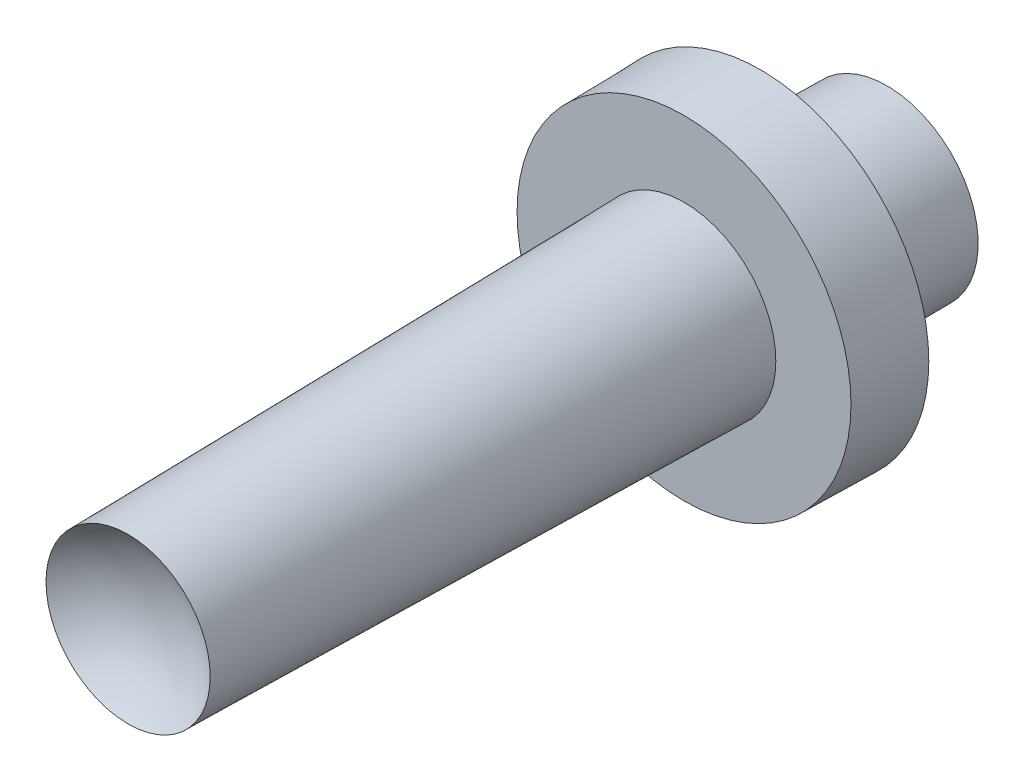
ISO-10303-21;
HEADER;
FILE_DESCRIPTION(('STEP AP214'),'2;1');
FILE_NAME('part.step','',(''),(''),'','','');
FILE_SCHEMA(('AUTOMOTIVE_DESIGN { 1 0 10303 214 1 1 1 1 }'));
ENDSEC;
DATA;
#1=APPLICATION_CONTEXT('core data for automotive mechanical design processes');
#2=APPLICATION_PROTOCOL_DEFINITION('international standard','automotive_design',2000,#1);
#3=PRODUCT_CONTEXT('',#1,'mechanical');
#4=PRODUCT('Part','Part','',(#3));
#5=PRODUCT_RELATED_PRODUCT_CATEGORY('part','',(#4));
#6=PRODUCT_DEFINITION_FORMATION('','',#4);
#7=PRODUCT_DEFINITION_CONTEXT('part definition',#1,'design');
#8=PRODUCT_DEFINITION('design','',#6,#7);
#9=PRODUCT_DEFINITION_SHAPE('','',#8);
#10=(LENGTH_UNIT() NAMED_UNIT(*) SI_UNIT(.MILLI.,.METRE.));
#11=(NAMED_UNIT(*) PLANE_ANGLE_UNIT() SI_UNIT($,.RADIAN.));
#12=(NAMED_UNIT(*) SI_UNIT($,.STERADIAN.) SOLID_ANGLE_UNIT());
#13=UNCERTAINTY_MEASURE_WITH_UNIT(LENGTH_MEASURE(1.E-05),#10,'distance_accuracy_value','');
#14=(GEOMETRIC_REPRESENTATION_CONTEXT(3) GLOBAL_UNCERTAINTY_ASSIGNED_CONTEXT((#13)) GLOBAL_UNIT_ASSIGNED_CONTEXT((#10,
#11,#12)) REPRESENTATION_CONTEXT('',''));
#15=CARTESIAN_POINT('',(0.,0.,0.));
#16=DIRECTION('',(0.,0.,1.));
#17=DIRECTION('',(1.,0.,0.));
#18=AXIS2_PLACEMENT_3D('',#15,#16,#17);
#19=CARTESIAN_POINT('',(0.,0.,0.));
#20=DIRECTION('',(0.,0.,1.));
#21=DIRECTION('',(1.,0.,0.));
#22=AXIS2_PLACEMENT_3D('',#19,#20,#21);
#23=PLANE('',#22);
#24=CARTESIAN_POINT('',(0.,0.,0.));
#25=DIRECTION('',(0.,0.,1.));
#26=DIRECTION('',(1.,0.,0.));
#27=AXIS2_PLACEMENT_3D('',#24,#25,#26);
#28=CIRCLE('',#27,2.794);
#29=CARTESIAN_POINT('',(2.794,0.,0.));
#30=VERTEX_POINT('',#29);
#31=EDGE_CURVE('E55',#30,#30,#28,.T.);
#32=ORIENTED_EDGE('',*,*,#31,.F.);
#33=EDGE_LOOP('',(#32));
#34=FACE_BOUND('',#33,.T.);
#35=CARTESIAN_POINT('',(0.,0.,0.));
#36=DIRECTION('',(0.,0.,1.));
#37=DIRECTION('',(1.,0.,0.));
#38=AXIS2_PLACEMENT_3D('',#35,#36,#37);
#39=CIRCLE('',#38,1.549999948);
#40=CARTESIAN_POINT('',(1.549999948,0.,0.));
#41=VERTEX_POINT('',#40);
#42=EDGE_CURVE('E12',#41,#41,#39,.F.);
#43=ORIENTED_EDGE('',*,*,#42,.F.);
#44=EDGE_LOOP('',(#43));
#45=FACE_BOUND('',#44,.T.);
#46=ADVANCED_FACE('F44',(#34,#45),#23,.F.);
#47=CARTESIAN_POINT('',(0.,0.,1.27));
#48=DIRECTION('',(0.,0.,1.));
#49=DIRECTION('',(1.,0.,0.));
#50=AXIS2_PLACEMENT_3D('',#47,#48,#49);
#51=PLANE('',#50);
#52=CARTESIAN_POINT('',(0.,0.,1.27));
#53=DIRECTION('',(0.,0.,1.));
#54=DIRECTION('',(1.,0.,0.));
#55=AXIS2_PLACEMENT_3D('',#52,#53,#54);
#56=CIRCLE('',#55,2.77183206754116);
#57=CARTESIAN_POINT('',(2.77183206754116,0.,1.27));
#58=VERTEX_POINT('',#57);
#59=EDGE_CURVE('E51',#58,#58,#56,.T.);
#60=ORIENTED_EDGE('',*,*,#59,.T.);
#61=EDGE_LOOP('',(#60));
#62=FACE_BOUND('',#61,.T.);
#63=CARTESIAN_POINT('',(0.,0.,1.27));
#64=DIRECTION('',(0.,0.,1.));
#65=DIRECTION('',(1.,0.,0.));
#66=AXIS2_PLACEMENT_3D('',#63,#64,#65);
#67=CIRCLE('',#66,1.524);
#68=CARTESIAN_POINT('',(1.524,0.,1.27));
#69=VERTEX_POINT('',#68);
#70=EDGE_CURVE('E59',#69,#69,#67,.T.);
#71=ORIENTED_EDGE('',*,*,#70,.F.);
#72=EDGE_LOOP('',(#71));
#73=FACE_BOUND('',#72,.T.);
#74=ADVANCED_FACE('F85',(#62,#73),#51,.T.);
#75=CARTESIAN_POINT('',(0.,0.,0.));
#76=DIRECTION('',(0.,0.,-1.));
#77=DIRECTION('',(1.,0.,0.));
#78=AXIS2_PLACEMENT_3D('',#75,#76,#77);
#79=CONICAL_SURFACE('',#78,2.794,0.0174532925199433);
#80=ORIENTED_EDGE('',*,*,#59,.F.);
#81=EDGE_LOOP('',(#80));
#82=FACE_BOUND('',#81,.T.);
#83=ORIENTED_EDGE('',*,*,#31,.T.);
#84=EDGE_LOOP('',(#83));
#85=FACE_BOUND('',#84,.T.);
#86=ADVANCED_FACE('F46',(#82,#85),#79,.T.);
#87=CARTESIAN_POINT('',(0.,0.,1.27));
#88=DIRECTION('',(0.,0.,-1.));
#89=DIRECTION('',(1.,0.,0.));
#90=AXIS2_PLACEMENT_3D('',#87,#88,#89);
#91=CONICAL_SURFACE('',#90,1.524,0.0174532925199433);
#92=CARTESIAN_POINT('',(0.,0.,10.50000005));
#93=DIRECTION('',(0.,0.,-1.));
#94=DIRECTION('',(-1.,0.,0.));
#95=AXIS2_PLACEMENT_3D('',#92,#93,#94);
#96=CIRCLE('',#95,1.3628897498398);
#97=CARTESIAN_POINT('',(-1.3628897498398,0.,10.50000005));
#98=VERTEX_POINT('',#97);
#99=EDGE_CURVE('E67',#98,#98,#96,.T.);
#100=ORIENTED_EDGE('',*,*,#99,.T.);
#101=EDGE_LOOP('',(#100));
#102=FACE_BOUND('',#101,.T.);
#103=ORIENTED_EDGE('',*,*,#70,.T.);
#104=EDGE_LOOP('',(#103));
#105=FACE_BOUND('',#104,.T.);
#106=ADVANCED_FACE('F71',(#102,#105),#91,.T.);
#107=CARTESIAN_POINT('',(0.,0.,0.));
#108=DIRECTION('',(0.,0.,1.));
#109=DIRECTION('',(-1.,0.,0.));
#110=AXIS2_PLACEMENT_3D('',#107,#108,#109);
#111=CONICAL_SURFACE('',#110,1.549999948,0.0174532925199433);
#112=CARTESIAN_POINT('',(0.,0.,-2.1));
#113=DIRECTION('',(0.,0.,-1.));
#114=DIRECTION('',(-1.,0.,0.));
#115=AXIS2_PLACEMENT_3D('',#112,#113,#114);
#116=CIRCLE('',#115,1.51334431165074);
#117=CARTESIAN_POINT('',(-1.51334431165074,0.,-2.1));
#118=VERTEX_POINT('',#117);
#119=EDGE_CURVE('E64',#118,#118,#116,.T.);
#120=ORIENTED_EDGE('',*,*,#119,.F.);
#121=EDGE_LOOP('',(#120));
#122=FACE_BOUND('',#121,.T.);
#123=ORIENTED_EDGE('',*,*,#42,.T.);
#124=EDGE_LOOP('',(#123));
#125=FACE_BOUND('',#124,.T.);
#126=ADVANCED_FACE('F81',(#122,#125),#111,.T.);
#127=CARTESIAN_POINT('',(0.,0.,-2.1));
#128=DIRECTION('',(0.,0.,-1.));
#129=DIRECTION('',(-1.,0.,0.));
#130=AXIS2_PLACEMENT_3D('',#127,#128,#129);
#131=PLANE('',#130);
#132=ORIENTED_EDGE('',*,*,#119,.T.);
#133=EDGE_LOOP('',(#132));
#134=FACE_BOUND('',#133,.T.);
#135=ADVANCED_FACE('F76',(#134),#131,.T.);
#136=CARTESIAN_POINT('',(0.,0.,11.8826155029513));
#137=DIRECTION('',(0.,0.,-1.));
#138=DIRECTION('',(1.,0.,0.));
#139=AXIS2_PLACEMENT_3D('',#136,#137,#138);
#140=SPHERICAL_SURFACE('',#139,1.9414154529513);
#141=ORIENTED_EDGE('',*,*,#99,.F.);
#142=EDGE_LOOP('',(#141));
#143=FACE_BOUND('',#142,.T.);
#144=ADVANCED_FACE('F74',(#143),#140,.F.);
#145=CLOSED_SHELL('',(#46,#74,#86,#106,#126,#135,#144));
#146=MANIFOLD_SOLID_BREP('B2',#145);
#147=ADVANCED_BREP_SHAPE_REPRESENTATION('',(#18,#146),#14);
#148=SHAPE_DEFINITION_REPRESENTATION(#9,#147);
ENDSEC;
END-ISO-10303-21;
